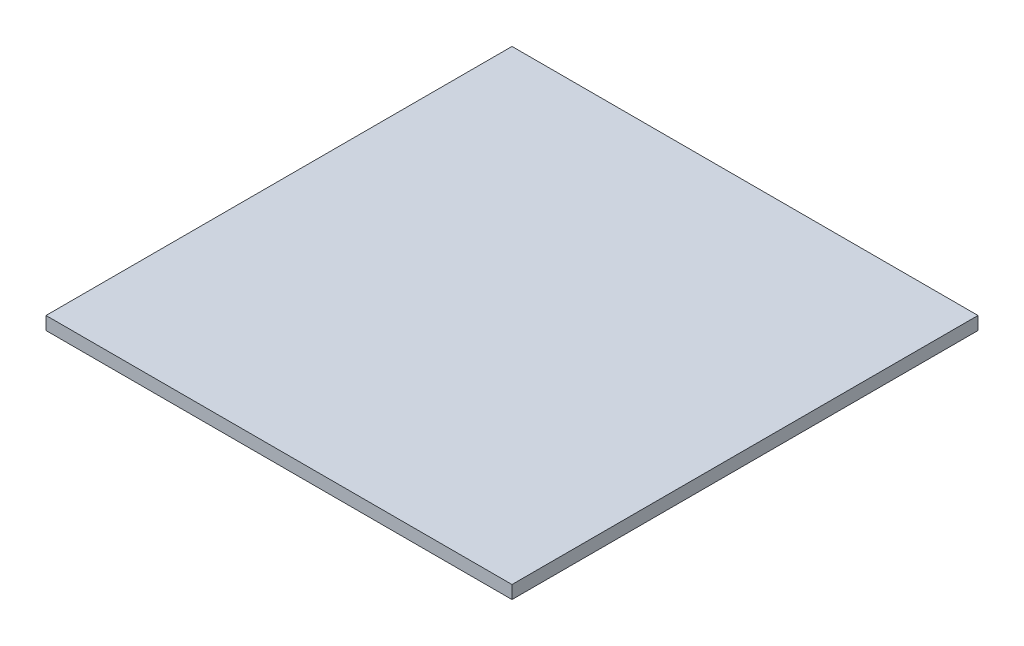
ISO-10303-21;
HEADER;
FILE_DESCRIPTION(('STEP AP214'),'2;1');
FILE_NAME('part.step','',(''),(''),'','','');
FILE_SCHEMA(('AUTOMOTIVE_DESIGN { 1 0 10303 214 1 1 1 1 }'));
ENDSEC;
DATA;
#1=APPLICATION_CONTEXT('core data for automotive mechanical design processes');
#2=APPLICATION_PROTOCOL_DEFINITION('international standard','automotive_design',2000,#1);
#3=PRODUCT_CONTEXT('',#1,'mechanical');
#4=PRODUCT('Part','Part','',(#3));
#5=PRODUCT_RELATED_PRODUCT_CATEGORY('part','',(#4));
#6=PRODUCT_DEFINITION_FORMATION('','',#4);
#7=PRODUCT_DEFINITION_CONTEXT('part definition',#1,'design');
#8=PRODUCT_DEFINITION('design','',#6,#7);
#9=PRODUCT_DEFINITION_SHAPE('','',#8);
#10=(LENGTH_UNIT() NAMED_UNIT(*) SI_UNIT(.MILLI.,.METRE.));
#11=(NAMED_UNIT(*) PLANE_ANGLE_UNIT() SI_UNIT($,.RADIAN.));
#12=(NAMED_UNIT(*) SI_UNIT($,.STERADIAN.) SOLID_ANGLE_UNIT());
#13=UNCERTAINTY_MEASURE_WITH_UNIT(LENGTH_MEASURE(1.E-05),#10,'distance_accuracy_value','');
#14=(GEOMETRIC_REPRESENTATION_CONTEXT(3) GLOBAL_UNCERTAINTY_ASSIGNED_CONTEXT((#13)) GLOBAL_UNIT_ASSIGNED_CONTEXT((#10,
#11,#12)) REPRESENTATION_CONTEXT('',''));
#15=CARTESIAN_POINT('',(0.,0.,0.));
#16=DIRECTION('',(0.,0.,1.));
#17=DIRECTION('',(1.,0.,0.));
#18=AXIS2_PLACEMENT_3D('',#15,#16,#17);
#19=CARTESIAN_POINT('',(107.,6.,107.));
#20=DIRECTION('',(0.,0.,-1.));
#21=DIRECTION('',(-1.,0.,0.));
#22=AXIS2_PLACEMENT_3D('',#19,#20,#21);
#23=PLANE('',#22);
#24=DIRECTION('',(1.,0.,0.));
#25=VECTOR('',#24,1.);
#26=CARTESIAN_POINT('',(107.,0.,107.));
#27=LINE('',#26,#25);
#28=CARTESIAN_POINT('',(-107.,0.,107.));
#29=VERTEX_POINT('',#28);
#30=CARTESIAN_POINT('',(107.,0.,107.));
#31=VERTEX_POINT('',#30);
#32=EDGE_CURVE('E86',#29,#31,#27,.T.);
#33=ORIENTED_EDGE('',*,*,#32,.T.);
#34=DIRECTION('',(0.,-1.,0.));
#35=VECTOR('',#34,1.);
#36=CARTESIAN_POINT('',(107.,6.,107.));
#37=LINE('',#36,#35);
#38=CARTESIAN_POINT('',(107.,6.,107.));
#39=VERTEX_POINT('',#38);
#40=EDGE_CURVE('E40',#39,#31,#37,.T.);
#41=ORIENTED_EDGE('',*,*,#40,.F.);
#42=DIRECTION('',(1.,0.,0.));
#43=VECTOR('',#42,1.);
#44=CARTESIAN_POINT('',(107.,6.,107.));
#45=LINE('',#44,#43);
#46=CARTESIAN_POINT('',(-107.,6.,107.));
#47=VERTEX_POINT('',#46);
#48=EDGE_CURVE('E79',#47,#39,#45,.T.);
#49=ORIENTED_EDGE('',*,*,#48,.F.);
#50=DIRECTION('',(0.,-1.,0.));
#51=VECTOR('',#50,1.);
#52=CARTESIAN_POINT('',(-107.,6.,107.));
#53=LINE('',#52,#51);
#54=EDGE_CURVE('E11',#47,#29,#53,.T.);
#55=ORIENTED_EDGE('',*,*,#54,.T.);
#56=EDGE_LOOP('',(#33,#41,#49,#55));
#57=FACE_BOUND('',#56,.T.);
#58=ADVANCED_FACE('F32',(#57),#23,.F.);
#59=CARTESIAN_POINT('',(107.,6.,-107.));
#60=DIRECTION('',(-1.,0.,0.));
#61=DIRECTION('',(0.,0.,1.));
#62=AXIS2_PLACEMENT_3D('',#59,#60,#61);
#63=PLANE('',#62);
#64=DIRECTION('',(0.,0.,-1.));
#65=VECTOR('',#64,1.);
#66=CARTESIAN_POINT('',(107.,0.,-107.));
#67=LINE('',#66,#65);
#68=CARTESIAN_POINT('',(107.,0.,-107.));
#69=VERTEX_POINT('',#68);
#70=EDGE_CURVE('E66',#31,#69,#67,.T.);
#71=ORIENTED_EDGE('',*,*,#70,.T.);
#72=DIRECTION('',(0.,-1.,0.));
#73=VECTOR('',#72,1.);
#74=CARTESIAN_POINT('',(107.,6.,-107.));
#75=LINE('',#74,#73);
#76=CARTESIAN_POINT('',(107.,6.,-107.));
#77=VERTEX_POINT('',#76);
#78=EDGE_CURVE('E87',#77,#69,#75,.T.);
#79=ORIENTED_EDGE('',*,*,#78,.F.);
#80=DIRECTION('',(0.,0.,-1.));
#81=VECTOR('',#80,1.);
#82=CARTESIAN_POINT('',(107.,6.,-107.));
#83=LINE('',#82,#81);
#84=EDGE_CURVE('E83',#39,#77,#83,.T.);
#85=ORIENTED_EDGE('',*,*,#84,.F.);
#86=ORIENTED_EDGE('',*,*,#40,.T.);
#87=EDGE_LOOP('',(#71,#79,#85,#86));
#88=FACE_BOUND('',#87,.T.);
#89=ADVANCED_FACE('F88',(#88),#63,.F.);
#90=CARTESIAN_POINT('',(-107.,6.,-107.));
#91=DIRECTION('',(0.,0.,1.));
#92=DIRECTION('',(1.,0.,0.));
#93=AXIS2_PLACEMENT_3D('',#90,#91,#92);
#94=PLANE('',#93);
#95=DIRECTION('',(-1.,0.,0.));
#96=VECTOR('',#95,1.);
#97=CARTESIAN_POINT('',(-107.,0.,-107.));
#98=LINE('',#97,#96);
#99=CARTESIAN_POINT('',(-107.,0.,-107.));
#100=VERTEX_POINT('',#99);
#101=EDGE_CURVE('E73',#69,#100,#98,.T.);
#102=ORIENTED_EDGE('',*,*,#101,.T.);
#103=DIRECTION('',(0.,-1.,0.));
#104=VECTOR('',#103,1.);
#105=CARTESIAN_POINT('',(-107.,6.,-107.));
#106=LINE('',#105,#104);
#107=CARTESIAN_POINT('',(-107.,6.,-107.));
#108=VERTEX_POINT('',#107);
#109=EDGE_CURVE('E92',#108,#100,#106,.T.);
#110=ORIENTED_EDGE('',*,*,#109,.F.);
#111=DIRECTION('',(-1.,0.,0.));
#112=VECTOR('',#111,1.);
#113=CARTESIAN_POINT('',(-107.,6.,-107.));
#114=LINE('',#113,#112);
#115=EDGE_CURVE('E90',#77,#108,#114,.T.);
#116=ORIENTED_EDGE('',*,*,#115,.F.);
#117=ORIENTED_EDGE('',*,*,#78,.T.);
#118=EDGE_LOOP('',(#102,#110,#116,#117));
#119=FACE_BOUND('',#118,.T.);
#120=ADVANCED_FACE('F102',(#119),#94,.F.);
#121=CARTESIAN_POINT('',(-107.,6.,0.));
#122=DIRECTION('',(1.,0.,0.));
#123=DIRECTION('',(0.,0.,-1.));
#124=AXIS2_PLACEMENT_3D('',#121,#122,#123);
#125=PLANE('',#124);
#126=DIRECTION('',(0.,0.,1.));
#127=VECTOR('',#126,1.);
#128=CARTESIAN_POINT('',(-107.,0.,0.));
#129=LINE('',#128,#127);
#130=EDGE_CURVE('E99',#100,#29,#129,.T.);
#131=ORIENTED_EDGE('',*,*,#130,.T.);
#132=ORIENTED_EDGE('',*,*,#54,.F.);
#133=DIRECTION('',(0.,0.,1.));
#134=VECTOR('',#133,1.);
#135=CARTESIAN_POINT('',(-107.,6.,107.));
#136=LINE('',#135,#134);
#137=EDGE_CURVE('E48',#108,#47,#136,.T.);
#138=ORIENTED_EDGE('',*,*,#137,.F.);
#139=ORIENTED_EDGE('',*,*,#109,.T.);
#140=EDGE_LOOP('',(#131,#132,#138,#139));
#141=FACE_BOUND('',#140,.T.);
#142=ADVANCED_FACE('F106',(#141),#125,.F.);
#143=CARTESIAN_POINT('',(0.,6.,0.));
#144=DIRECTION('',(0.,-1.,0.));
#145=DIRECTION('',(0.,0.,-1.));
#146=AXIS2_PLACEMENT_3D('',#143,#144,#145);
#147=PLANE('',#146);
#148=ORIENTED_EDGE('',*,*,#137,.T.);
#149=ORIENTED_EDGE('',*,*,#48,.T.);
#150=ORIENTED_EDGE('',*,*,#84,.T.);
#151=ORIENTED_EDGE('',*,*,#115,.T.);
#152=EDGE_LOOP('',(#148,#149,#150,#151));
#153=FACE_BOUND('',#152,.T.);
#154=ADVANCED_FACE('F81',(#153),#147,.F.);
#155=CARTESIAN_POINT('',(0.,0.,0.));
#156=DIRECTION('',(0.,-1.,0.));
#157=DIRECTION('',(0.,0.,-1.));
#158=AXIS2_PLACEMENT_3D('',#155,#156,#157);
#159=PLANE('',#158);
#160=ORIENTED_EDGE('',*,*,#32,.F.);
#161=ORIENTED_EDGE('',*,*,#130,.F.);
#162=ORIENTED_EDGE('',*,*,#101,.F.);
#163=ORIENTED_EDGE('',*,*,#70,.F.);
#164=EDGE_LOOP('',(#160,#161,#162,#163));
#165=FACE_BOUND('',#164,.T.);
#166=ADVANCED_FACE('F105',(#165),#159,.T.);
#167=CLOSED_SHELL('',(#58,#89,#120,#142,#154,#166));
#168=MANIFOLD_SOLID_BREP('B2',#167);
#169=ADVANCED_BREP_SHAPE_REPRESENTATION('',(#18,#168),#14);
#170=SHAPE_DEFINITION_REPRESENTATION(#9,#169);
ENDSEC;
END-ISO-10303-21;
